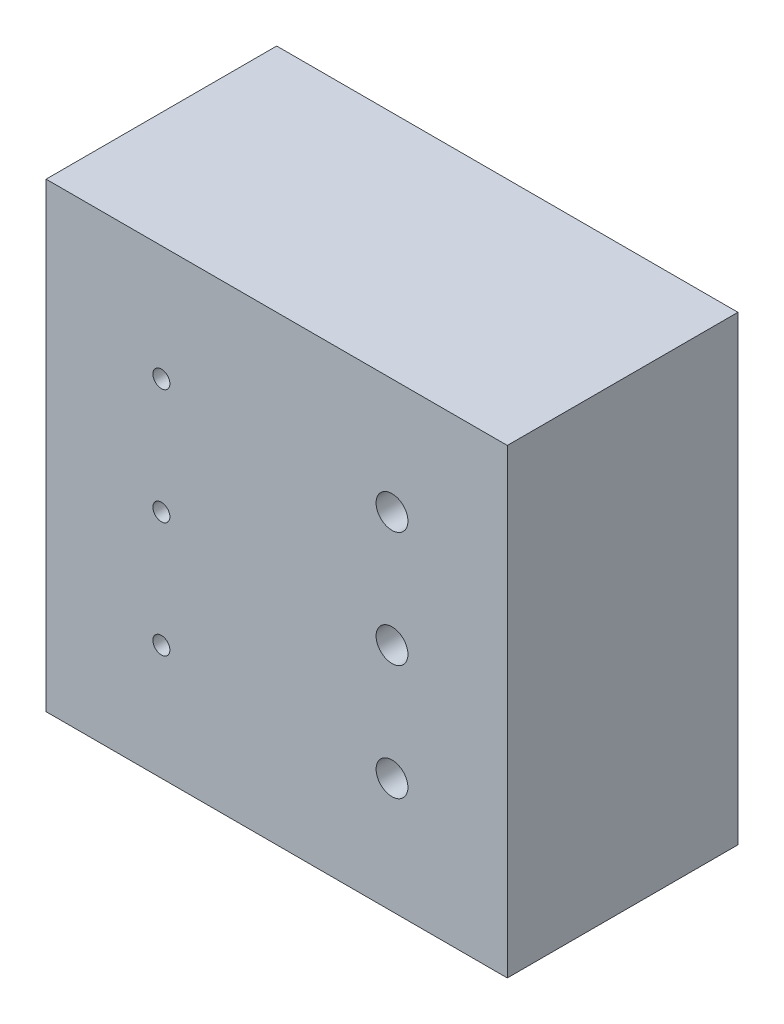
ISO-10303-21;
HEADER;
FILE_DESCRIPTION(('STEP AP214'),'2;1');
FILE_NAME('part.step','',(''),(''),'','','');
FILE_SCHEMA(('AUTOMOTIVE_DESIGN { 1 0 10303 214 1 1 1 1 }'));
ENDSEC;
DATA;
#1=APPLICATION_CONTEXT('core data for automotive mechanical design processes');
#2=APPLICATION_PROTOCOL_DEFINITION('international standard','automotive_design',2000,#1);
#3=PRODUCT_CONTEXT('',#1,'mechanical');
#4=PRODUCT('Part','Part','',(#3));
#5=PRODUCT_RELATED_PRODUCT_CATEGORY('part','',(#4));
#6=PRODUCT_DEFINITION_FORMATION('','',#4);
#7=PRODUCT_DEFINITION_CONTEXT('part definition',#1,'design');
#8=PRODUCT_DEFINITION('design','',#6,#7);
#9=PRODUCT_DEFINITION_SHAPE('','',#8);
#10=(LENGTH_UNIT() NAMED_UNIT(*) SI_UNIT(.MILLI.,.METRE.));
#11=(NAMED_UNIT(*) PLANE_ANGLE_UNIT() SI_UNIT($,.RADIAN.));
#12=(NAMED_UNIT(*) SI_UNIT($,.STERADIAN.) SOLID_ANGLE_UNIT());
#13=UNCERTAINTY_MEASURE_WITH_UNIT(LENGTH_MEASURE(1.E-05),#10,'distance_accuracy_value','');
#14=(GEOMETRIC_REPRESENTATION_CONTEXT(3) GLOBAL_UNCERTAINTY_ASSIGNED_CONTEXT((#13)) GLOBAL_UNIT_ASSIGNED_CONTEXT((#10,
#11,#12)) REPRESENTATION_CONTEXT('',''));
#15=CARTESIAN_POINT('',(0.,0.,0.));
#16=DIRECTION('',(0.,0.,1.));
#17=DIRECTION('',(1.,0.,0.));
#18=AXIS2_PLACEMENT_3D('',#15,#16,#17);
#19=CARTESIAN_POINT('',(50.,50.,50.));
#20=DIRECTION('',(-1.,0.,0.));
#21=DIRECTION('',(0.,-1.,0.));
#22=AXIS2_PLACEMENT_3D('',#19,#20,#21);
#23=PLANE('',#22);
#24=DIRECTION('',(0.,1.,0.));
#25=VECTOR('',#24,1.);
#26=CARTESIAN_POINT('',(50.,50.,0.));
#27=LINE('',#26,#25);
#28=CARTESIAN_POINT('',(50.,-50.,0.));
#29=VERTEX_POINT('',#28);
#30=CARTESIAN_POINT('',(50.,50.,0.));
#31=VERTEX_POINT('',#30);
#32=EDGE_CURVE('E102',#29,#31,#27,.T.);
#33=ORIENTED_EDGE('',*,*,#32,.T.);
#34=DIRECTION('',(0.,0.,-1.));
#35=VECTOR('',#34,1.);
#36=CARTESIAN_POINT('',(50.,50.,50.));
#37=LINE('',#36,#35);
#38=CARTESIAN_POINT('',(50.,50.,50.));
#39=VERTEX_POINT('',#38);
#40=EDGE_CURVE('E11',#39,#31,#37,.T.);
#41=ORIENTED_EDGE('',*,*,#40,.F.);
#42=DIRECTION('',(0.,1.,0.));
#43=VECTOR('',#42,1.);
#44=CARTESIAN_POINT('',(50.,50.,50.));
#45=LINE('',#44,#43);
#46=CARTESIAN_POINT('',(50.,-50.,50.));
#47=VERTEX_POINT('',#46);
#48=EDGE_CURVE('E90',#47,#39,#45,.T.);
#49=ORIENTED_EDGE('',*,*,#48,.F.);
#50=DIRECTION('',(0.,0.,-1.));
#51=VECTOR('',#50,1.);
#52=CARTESIAN_POINT('',(50.,-50.,50.));
#53=LINE('',#52,#51);
#54=EDGE_CURVE('E98',#47,#29,#53,.T.);
#55=ORIENTED_EDGE('',*,*,#54,.T.);
#56=EDGE_LOOP('',(#33,#41,#49,#55));
#57=FACE_BOUND('',#56,.T.);
#58=ADVANCED_FACE('F39',(#57),#23,.F.);
#59=CARTESIAN_POINT('',(-50.,50.,50.));
#60=DIRECTION('',(0.,-1.,0.));
#61=DIRECTION('',(0.,0.,-1.));
#62=AXIS2_PLACEMENT_3D('',#59,#60,#61);
#63=PLANE('',#62);
#64=DIRECTION('',(-1.,0.,0.));
#65=VECTOR('',#64,1.);
#66=CARTESIAN_POINT('',(-50.,50.,0.));
#67=LINE('',#66,#65);
#68=CARTESIAN_POINT('',(-50.,50.,0.));
#69=VERTEX_POINT('',#68);
#70=EDGE_CURVE('E94',#31,#69,#67,.T.);
#71=ORIENTED_EDGE('',*,*,#70,.T.);
#72=DIRECTION('',(0.,0.,-1.));
#73=VECTOR('',#72,1.);
#74=CARTESIAN_POINT('',(-50.,50.,50.));
#75=LINE('',#74,#73);
#76=CARTESIAN_POINT('',(-50.,50.,50.));
#77=VERTEX_POINT('',#76);
#78=EDGE_CURVE('E47',#77,#69,#75,.T.);
#79=ORIENTED_EDGE('',*,*,#78,.F.);
#80=DIRECTION('',(-1.,0.,0.));
#81=VECTOR('',#80,1.);
#82=CARTESIAN_POINT('',(-50.,50.,50.));
#83=LINE('',#82,#81);
#84=EDGE_CURVE('E85',#39,#77,#83,.T.);
#85=ORIENTED_EDGE('',*,*,#84,.F.);
#86=ORIENTED_EDGE('',*,*,#40,.T.);
#87=EDGE_LOOP('',(#71,#79,#85,#86));
#88=FACE_BOUND('',#87,.T.);
#89=ADVANCED_FACE('F93',(#88),#63,.F.);
#90=CARTESIAN_POINT('',(-50.,50.,50.));
#91=DIRECTION('',(1.,0.,0.));
#92=DIRECTION('',(0.,1.,0.));
#93=AXIS2_PLACEMENT_3D('',#90,#91,#92);
#94=PLANE('',#93);
#95=DIRECTION('',(0.,-1.,0.));
#96=VECTOR('',#95,1.);
#97=CARTESIAN_POINT('',(-50.,50.,0.));
#98=LINE('',#97,#96);
#99=CARTESIAN_POINT('',(-50.,-50.,0.));
#100=VERTEX_POINT('',#99);
#101=EDGE_CURVE('E72',#69,#100,#98,.T.);
#102=ORIENTED_EDGE('',*,*,#101,.T.);
#103=DIRECTION('',(0.,0.,-1.));
#104=VECTOR('',#103,1.);
#105=CARTESIAN_POINT('',(-50.,-50.,50.));
#106=LINE('',#105,#104);
#107=CARTESIAN_POINT('',(-50.,-50.,50.));
#108=VERTEX_POINT('',#107);
#109=EDGE_CURVE('E95',#108,#100,#106,.T.);
#110=ORIENTED_EDGE('',*,*,#109,.F.);
#111=DIRECTION('',(0.,-1.,0.));
#112=VECTOR('',#111,1.);
#113=CARTESIAN_POINT('',(-50.,50.,50.));
#114=LINE('',#113,#112);
#115=EDGE_CURVE('E88',#77,#108,#114,.T.);
#116=ORIENTED_EDGE('',*,*,#115,.F.);
#117=ORIENTED_EDGE('',*,*,#78,.T.);
#118=EDGE_LOOP('',(#102,#110,#116,#117));
#119=FACE_BOUND('',#118,.T.);
#120=ADVANCED_FACE('F96',(#119),#94,.F.);
#121=CARTESIAN_POINT('',(-50.,-50.,50.));
#122=DIRECTION('',(0.,1.,0.));
#123=DIRECTION('',(0.,0.,1.));
#124=AXIS2_PLACEMENT_3D('',#121,#122,#123);
#125=PLANE('',#124);
#126=DIRECTION('',(1.,0.,0.));
#127=VECTOR('',#126,1.);
#128=CARTESIAN_POINT('',(-50.,-50.,0.));
#129=LINE('',#128,#127);
#130=EDGE_CURVE('E78',#100,#29,#129,.T.);
#131=ORIENTED_EDGE('',*,*,#130,.T.);
#132=ORIENTED_EDGE('',*,*,#54,.F.);
#133=DIRECTION('',(1.,0.,0.));
#134=VECTOR('',#133,1.);
#135=CARTESIAN_POINT('',(-50.,-50.,50.));
#136=LINE('',#135,#134);
#137=EDGE_CURVE('E55',#108,#47,#136,.T.);
#138=ORIENTED_EDGE('',*,*,#137,.F.);
#139=ORIENTED_EDGE('',*,*,#109,.T.);
#140=EDGE_LOOP('',(#131,#132,#138,#139));
#141=FACE_BOUND('',#140,.T.);
#142=ADVANCED_FACE('F110',(#141),#125,.F.);
#143=CARTESIAN_POINT('',(0.,0.,50.));
#144=DIRECTION('',(0.,0.,1.));
#145=DIRECTION('',(1.,0.,0.));
#146=AXIS2_PLACEMENT_3D('',#143,#144,#145);
#147=PLANE('',#146);
#148=CARTESIAN_POINT('',(-25.,0.,50.));
#149=DIRECTION('',(0.,0.,1.));
#150=DIRECTION('',(1.,0.,0.));
#151=AXIS2_PLACEMENT_3D('',#148,#149,#150);
#152=CIRCLE('',#151,1.84);
#153=CARTESIAN_POINT('',(-23.16,0.,50.));
#154=VERTEX_POINT('',#153);
#155=EDGE_CURVE('E137',#154,#154,#152,.T.);
#156=ORIENTED_EDGE('',*,*,#155,.F.);
#157=EDGE_LOOP('',(#156));
#158=FACE_BOUND('',#157,.T.);
#159=CARTESIAN_POINT('',(-25.,-25.,50.));
#160=DIRECTION('',(0.,0.,1.));
#161=DIRECTION('',(1.,0.,0.));
#162=AXIS2_PLACEMENT_3D('',#159,#160,#161);
#163=CIRCLE('',#162,1.84);
#164=CARTESIAN_POINT('',(-23.16,-25.,50.));
#165=VERTEX_POINT('',#164);
#166=EDGE_CURVE('E126',#165,#165,#163,.T.);
#167=ORIENTED_EDGE('',*,*,#166,.F.);
#168=EDGE_LOOP('',(#167));
#169=FACE_BOUND('',#168,.T.);
#170=CARTESIAN_POINT('',(-25.,25.,50.));
#171=DIRECTION('',(0.,0.,1.));
#172=DIRECTION('',(1.,0.,0.));
#173=AXIS2_PLACEMENT_3D('',#170,#171,#172);
#174=CIRCLE('',#173,1.84);
#175=CARTESIAN_POINT('',(-23.16,25.,50.));
#176=VERTEX_POINT('',#175);
#177=EDGE_CURVE('E125',#176,#176,#174,.T.);
#178=ORIENTED_EDGE('',*,*,#177,.F.);
#179=EDGE_LOOP('',(#178));
#180=FACE_BOUND('',#179,.T.);
#181=CARTESIAN_POINT('',(25.,-25.,50.));
#182=DIRECTION('',(0.,0.,1.));
#183=DIRECTION('',(1.,0.,0.));
#184=AXIS2_PLACEMENT_3D('',#181,#182,#183);
#185=CIRCLE('',#184,3.45);
#186=CARTESIAN_POINT('',(28.45,-25.,50.));
#187=VERTEX_POINT('',#186);
#188=EDGE_CURVE('E119',#187,#187,#185,.T.);
#189=ORIENTED_EDGE('',*,*,#188,.F.);
#190=EDGE_LOOP('',(#189));
#191=FACE_BOUND('',#190,.T.);
#192=CARTESIAN_POINT('',(25.,0.,50.));
#193=DIRECTION('',(0.,0.,1.));
#194=DIRECTION('',(1.,0.,0.));
#195=AXIS2_PLACEMENT_3D('',#192,#193,#194);
#196=CIRCLE('',#195,3.45);
#197=CARTESIAN_POINT('',(28.45,0.,50.));
#198=VERTEX_POINT('',#197);
#199=EDGE_CURVE('E138',#198,#198,#196,.T.);
#200=ORIENTED_EDGE('',*,*,#199,.F.);
#201=EDGE_LOOP('',(#200));
#202=FACE_BOUND('',#201,.T.);
#203=CARTESIAN_POINT('',(25.,25.,50.));
#204=DIRECTION('',(0.,0.,1.));
#205=DIRECTION('',(1.,0.,0.));
#206=AXIS2_PLACEMENT_3D('',#203,#204,#205);
#207=CIRCLE('',#206,3.45);
#208=CARTESIAN_POINT('',(28.45,25.,50.));
#209=VERTEX_POINT('',#208);
#210=EDGE_CURVE('E116',#209,#209,#207,.T.);
#211=ORIENTED_EDGE('',*,*,#210,.F.);
#212=EDGE_LOOP('',(#211));
#213=FACE_BOUND('',#212,.T.);
#214=ORIENTED_EDGE('',*,*,#48,.T.);
#215=ORIENTED_EDGE('',*,*,#84,.T.);
#216=ORIENTED_EDGE('',*,*,#115,.T.);
#217=ORIENTED_EDGE('',*,*,#137,.T.);
#218=EDGE_LOOP('',(#214,#215,#216,#217));
#219=FACE_BOUND('',#218,.T.);
#220=ADVANCED_FACE('F86',(#158,#169,#180,#191,#202,#213,#219),#147,.T.);
#221=CARTESIAN_POINT('',(0.,0.,0.));
#222=DIRECTION('',(0.,0.,1.));
#223=DIRECTION('',(1.,0.,0.));
#224=AXIS2_PLACEMENT_3D('',#221,#222,#223);
#225=PLANE('',#224);
#226=CARTESIAN_POINT('',(-25.,0.,0.));
#227=DIRECTION('',(0.,0.,1.));
#228=DIRECTION('',(1.,0.,0.));
#229=AXIS2_PLACEMENT_3D('',#226,#227,#228);
#230=CIRCLE('',#229,1.84);
#231=CARTESIAN_POINT('',(-23.16,0.,0.));
#232=VERTEX_POINT('',#231);
#233=EDGE_CURVE('E134',#232,#232,#230,.T.);
#234=ORIENTED_EDGE('',*,*,#233,.T.);
#235=EDGE_LOOP('',(#234));
#236=FACE_BOUND('',#235,.T.);
#237=CARTESIAN_POINT('',(-25.,-25.,0.));
#238=DIRECTION('',(0.,0.,1.));
#239=DIRECTION('',(1.,0.,0.));
#240=AXIS2_PLACEMENT_3D('',#237,#238,#239);
#241=CIRCLE('',#240,1.84);
#242=CARTESIAN_POINT('',(-23.16,-25.,0.));
#243=VERTEX_POINT('',#242);
#244=EDGE_CURVE('E141',#243,#243,#241,.T.);
#245=ORIENTED_EDGE('',*,*,#244,.T.);
#246=EDGE_LOOP('',(#245));
#247=FACE_BOUND('',#246,.T.);
#248=CARTESIAN_POINT('',(-25.,25.,0.));
#249=DIRECTION('',(0.,0.,1.));
#250=DIRECTION('',(1.,0.,0.));
#251=AXIS2_PLACEMENT_3D('',#248,#249,#250);
#252=CIRCLE('',#251,1.84);
#253=CARTESIAN_POINT('',(-23.16,25.,0.));
#254=VERTEX_POINT('',#253);
#255=EDGE_CURVE('E122',#254,#254,#252,.T.);
#256=ORIENTED_EDGE('',*,*,#255,.T.);
#257=EDGE_LOOP('',(#256));
#258=FACE_BOUND('',#257,.T.);
#259=CARTESIAN_POINT('',(25.,-25.,0.));
#260=DIRECTION('',(0.,0.,1.));
#261=DIRECTION('',(1.,0.,0.));
#262=AXIS2_PLACEMENT_3D('',#259,#260,#261);
#263=CIRCLE('',#262,3.45);
#264=CARTESIAN_POINT('',(28.45,-25.,0.));
#265=VERTEX_POINT('',#264);
#266=EDGE_CURVE('E129',#265,#265,#263,.T.);
#267=ORIENTED_EDGE('',*,*,#266,.T.);
#268=EDGE_LOOP('',(#267));
#269=FACE_BOUND('',#268,.T.);
#270=CARTESIAN_POINT('',(25.,0.,0.));
#271=DIRECTION('',(0.,0.,1.));
#272=DIRECTION('',(1.,0.,0.));
#273=AXIS2_PLACEMENT_3D('',#270,#271,#272);
#274=CIRCLE('',#273,3.45);
#275=CARTESIAN_POINT('',(28.45,0.,0.));
#276=VERTEX_POINT('',#275);
#277=EDGE_CURVE('E146',#276,#276,#274,.T.);
#278=ORIENTED_EDGE('',*,*,#277,.T.);
#279=EDGE_LOOP('',(#278));
#280=FACE_BOUND('',#279,.T.);
#281=CARTESIAN_POINT('',(25.,25.,0.));
#282=DIRECTION('',(0.,0.,1.));
#283=DIRECTION('',(1.,0.,0.));
#284=AXIS2_PLACEMENT_3D('',#281,#282,#283);
#285=CIRCLE('',#284,3.45);
#286=CARTESIAN_POINT('',(28.45,25.,0.));
#287=VERTEX_POINT('',#286);
#288=EDGE_CURVE('E105',#287,#287,#285,.T.);
#289=ORIENTED_EDGE('',*,*,#288,.T.);
#290=EDGE_LOOP('',(#289));
#291=FACE_BOUND('',#290,.T.);
#292=ORIENTED_EDGE('',*,*,#32,.F.);
#293=ORIENTED_EDGE('',*,*,#130,.F.);
#294=ORIENTED_EDGE('',*,*,#101,.F.);
#295=ORIENTED_EDGE('',*,*,#70,.F.);
#296=EDGE_LOOP('',(#292,#293,#294,#295));
#297=FACE_BOUND('',#296,.T.);
#298=ADVANCED_FACE('F113',(#236,#247,#258,#269,#280,#291,#297),#225,.F.);
#299=CARTESIAN_POINT('',(25.,25.,0.));
#300=DIRECTION('',(0.,0.,1.));
#301=DIRECTION('',(1.,0.,0.));
#302=AXIS2_PLACEMENT_3D('',#299,#300,#301);
#303=CYLINDRICAL_SURFACE('',#302,3.45);
#304=ORIENTED_EDGE('',*,*,#288,.F.);
#305=EDGE_LOOP('',(#304));
#306=FACE_BOUND('',#305,.T.);
#307=ORIENTED_EDGE('',*,*,#210,.T.);
#308=EDGE_LOOP('',(#307));
#309=FACE_BOUND('',#308,.T.);
#310=ADVANCED_FACE('F160',(#306,#309),#303,.F.);
#311=CARTESIAN_POINT('',(25.,0.,0.));
#312=DIRECTION('',(0.,0.,1.));
#313=DIRECTION('',(1.,0.,0.));
#314=AXIS2_PLACEMENT_3D('',#311,#312,#313);
#315=CYLINDRICAL_SURFACE('',#314,3.45);
#316=ORIENTED_EDGE('',*,*,#277,.F.);
#317=EDGE_LOOP('',(#316));
#318=FACE_BOUND('',#317,.T.);
#319=ORIENTED_EDGE('',*,*,#199,.T.);
#320=EDGE_LOOP('',(#319));
#321=FACE_BOUND('',#320,.T.);
#322=ADVANCED_FACE('F152',(#318,#321),#315,.F.);
#323=CARTESIAN_POINT('',(25.,-25.,0.));
#324=DIRECTION('',(0.,0.,1.));
#325=DIRECTION('',(1.,0.,0.));
#326=AXIS2_PLACEMENT_3D('',#323,#324,#325);
#327=CYLINDRICAL_SURFACE('',#326,3.45);
#328=ORIENTED_EDGE('',*,*,#266,.F.);
#329=EDGE_LOOP('',(#328));
#330=FACE_BOUND('',#329,.T.);
#331=ORIENTED_EDGE('',*,*,#188,.T.);
#332=EDGE_LOOP('',(#331));
#333=FACE_BOUND('',#332,.T.);
#334=ADVANCED_FACE('F168',(#330,#333),#327,.F.);
#335=CARTESIAN_POINT('',(-25.,25.,0.));
#336=DIRECTION('',(0.,0.,1.));
#337=DIRECTION('',(1.,0.,0.));
#338=AXIS2_PLACEMENT_3D('',#335,#336,#337);
#339=CYLINDRICAL_SURFACE('',#338,1.84);
#340=ORIENTED_EDGE('',*,*,#255,.F.);
#341=EDGE_LOOP('',(#340));
#342=FACE_BOUND('',#341,.T.);
#343=ORIENTED_EDGE('',*,*,#177,.T.);
#344=EDGE_LOOP('',(#343));
#345=FACE_BOUND('',#344,.T.);
#346=ADVANCED_FACE('F219',(#342,#345),#339,.F.);
#347=CARTESIAN_POINT('',(-25.,-25.,0.));
#348=DIRECTION('',(0.,0.,1.));
#349=DIRECTION('',(1.,0.,0.));
#350=AXIS2_PLACEMENT_3D('',#347,#348,#349);
#351=CYLINDRICAL_SURFACE('',#350,1.84);
#352=ORIENTED_EDGE('',*,*,#244,.F.);
#353=EDGE_LOOP('',(#352));
#354=FACE_BOUND('',#353,.T.);
#355=ORIENTED_EDGE('',*,*,#166,.T.);
#356=EDGE_LOOP('',(#355));
#357=FACE_BOUND('',#356,.T.);
#358=ADVANCED_FACE('F229',(#354,#357),#351,.F.);
#359=CARTESIAN_POINT('',(-25.,0.,0.));
#360=DIRECTION('',(0.,0.,1.));
#361=DIRECTION('',(1.,0.,0.));
#362=AXIS2_PLACEMENT_3D('',#359,#360,#361);
#363=CYLINDRICAL_SURFACE('',#362,1.84);
#364=ORIENTED_EDGE('',*,*,#233,.F.);
#365=EDGE_LOOP('',(#364));
#366=FACE_BOUND('',#365,.T.);
#367=ORIENTED_EDGE('',*,*,#155,.T.);
#368=EDGE_LOOP('',(#367));
#369=FACE_BOUND('',#368,.T.);
#370=ADVANCED_FACE('F238',(#366,#369),#363,.F.);
#371=CLOSED_SHELL('',(#58,#89,#120,#142,#220,#298,#310,#322,#334,#346,#358,#370));
#372=MANIFOLD_SOLID_BREP('B2',#371);
#373=ADVANCED_BREP_SHAPE_REPRESENTATION('',(#18,#372),#14);
#374=SHAPE_DEFINITION_REPRESENTATION(#9,#373);
ENDSEC;
END-ISO-10303-21;
